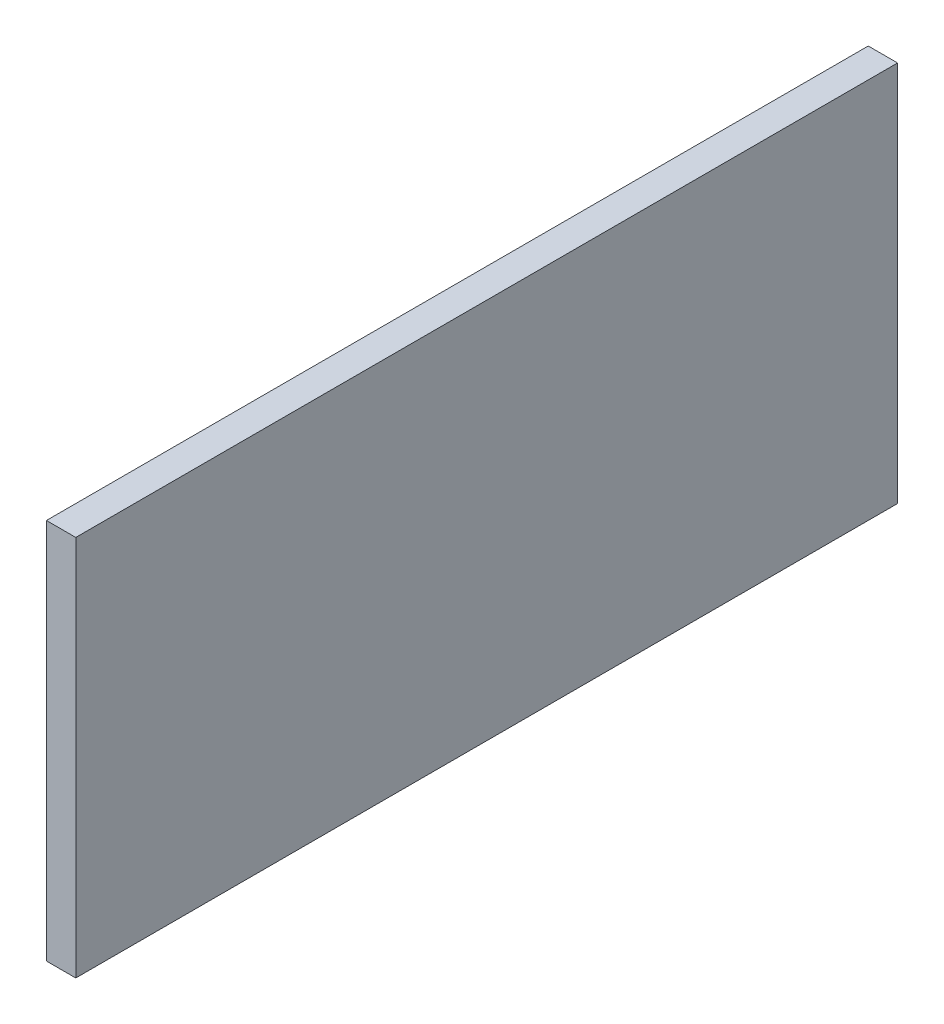
ISO-10303-21;
HEADER;
FILE_DESCRIPTION(('STEP AP214'),'2;1');
FILE_NAME('part.step','',(''),(''),'','','');
FILE_SCHEMA(('AUTOMOTIVE_DESIGN { 1 0 10303 214 1 1 1 1 }'));
ENDSEC;
DATA;
#1=APPLICATION_CONTEXT('core data for automotive mechanical design processes');
#2=APPLICATION_PROTOCOL_DEFINITION('international standard','automotive_design',2000,#1);
#3=PRODUCT_CONTEXT('',#1,'mechanical');
#4=PRODUCT('Part','Part','',(#3));
#5=PRODUCT_RELATED_PRODUCT_CATEGORY('part','',(#4));
#6=PRODUCT_DEFINITION_FORMATION('','',#4);
#7=PRODUCT_DEFINITION_CONTEXT('part definition',#1,'design');
#8=PRODUCT_DEFINITION('design','',#6,#7);
#9=PRODUCT_DEFINITION_SHAPE('','',#8);
#10=(LENGTH_UNIT() NAMED_UNIT(*) SI_UNIT(.MILLI.,.METRE.));
#11=(NAMED_UNIT(*) PLANE_ANGLE_UNIT() SI_UNIT($,.RADIAN.));
#12=(NAMED_UNIT(*) SI_UNIT($,.STERADIAN.) SOLID_ANGLE_UNIT());
#13=UNCERTAINTY_MEASURE_WITH_UNIT(LENGTH_MEASURE(1.E-05),#10,'distance_accuracy_value','');
#14=(GEOMETRIC_REPRESENTATION_CONTEXT(3) GLOBAL_UNCERTAINTY_ASSIGNED_CONTEXT((#13)) GLOBAL_UNIT_ASSIGNED_CONTEXT((#10,
#11,#12)) REPRESENTATION_CONTEXT('',''));
#15=CARTESIAN_POINT('',(0.,0.,0.));
#16=DIRECTION('',(0.,0.,1.));
#17=DIRECTION('',(1.,0.,0.));
#18=AXIS2_PLACEMENT_3D('',#15,#16,#17);
#19=CARTESIAN_POINT('',(6.,7.60305051409517,68.730415695083));
#20=DIRECTION('',(0.,0.,-1.));
#21=DIRECTION('',(0.,1.,0.));
#22=AXIS2_PLACEMENT_3D('',#19,#20,#21);
#23=PLANE('',#22);
#24=DIRECTION('',(0.,-1.,0.));
#25=VECTOR('',#24,1.);
#26=CARTESIAN_POINT('',(0.,7.60305051409517,68.730415695083));
#27=LINE('',#26,#25);
#28=CARTESIAN_POINT('',(0.,7.60305051409517,68.730415695083));
#29=VERTEX_POINT('',#28);
#30=CARTESIAN_POINT('',(0.,-70.3969494859048,68.730415695083));
#31=VERTEX_POINT('',#30);
#32=EDGE_CURVE('E96',#29,#31,#27,.T.);
#33=ORIENTED_EDGE('',*,*,#32,.T.);
#34=DIRECTION('',(-1.,0.,0.));
#35=VECTOR('',#34,1.);
#36=CARTESIAN_POINT('',(6.,-70.3969494859048,68.730415695083));
#37=LINE('',#36,#35);
#38=CARTESIAN_POINT('',(6.,-70.3969494859048,68.730415695083));
#39=VERTEX_POINT('',#38);
#40=EDGE_CURVE('E11',#39,#31,#37,.T.);
#41=ORIENTED_EDGE('',*,*,#40,.F.);
#42=DIRECTION('',(0.,-1.,0.));
#43=VECTOR('',#42,1.);
#44=CARTESIAN_POINT('',(6.,7.60305051409517,68.730415695083));
#45=LINE('',#44,#43);
#46=CARTESIAN_POINT('',(6.,7.60305051409517,68.730415695083));
#47=VERTEX_POINT('',#46);
#48=EDGE_CURVE('E84',#47,#39,#45,.T.);
#49=ORIENTED_EDGE('',*,*,#48,.F.);
#50=DIRECTION('',(-1.,0.,0.));
#51=VECTOR('',#50,1.);
#52=CARTESIAN_POINT('',(6.,7.60305051409517,68.730415695083));
#53=LINE('',#52,#51);
#54=EDGE_CURVE('E92',#47,#29,#53,.T.);
#55=ORIENTED_EDGE('',*,*,#54,.T.);
#56=EDGE_LOOP('',(#33,#41,#49,#55));
#57=FACE_BOUND('',#56,.T.);
#58=ADVANCED_FACE('F33',(#57),#23,.F.);
#59=CARTESIAN_POINT('',(6.,-70.3969494859048,68.730415695083));
#60=DIRECTION('',(0.,1.,0.));
#61=DIRECTION('',(0.,0.,1.));
#62=AXIS2_PLACEMENT_3D('',#59,#60,#61);
#63=PLANE('',#62);
#64=DIRECTION('',(0.,0.,-1.));
#65=VECTOR('',#64,1.);
#66=CARTESIAN_POINT('',(0.,-70.3969494859048,68.730415695083));
#67=LINE('',#66,#65);
#68=CARTESIAN_POINT('',(0.,-70.3969494859048,-99.2695843049171));
#69=VERTEX_POINT('',#68);
#70=EDGE_CURVE('E88',#31,#69,#67,.T.);
#71=ORIENTED_EDGE('',*,*,#70,.T.);
#72=DIRECTION('',(-1.,0.,0.));
#73=VECTOR('',#72,1.);
#74=CARTESIAN_POINT('',(6.,-70.3969494859048,-99.2695843049171));
#75=LINE('',#74,#73);
#76=CARTESIAN_POINT('',(6.,-70.3969494859048,-99.2695843049171));
#77=VERTEX_POINT('',#76);
#78=EDGE_CURVE('E41',#77,#69,#75,.T.);
#79=ORIENTED_EDGE('',*,*,#78,.F.);
#80=DIRECTION('',(0.,0.,-1.));
#81=VECTOR('',#80,1.);
#82=CARTESIAN_POINT('',(6.,-70.3969494859048,68.730415695083));
#83=LINE('',#82,#81);
#84=EDGE_CURVE('E79',#39,#77,#83,.T.);
#85=ORIENTED_EDGE('',*,*,#84,.F.);
#86=ORIENTED_EDGE('',*,*,#40,.T.);
#87=EDGE_LOOP('',(#71,#79,#85,#86));
#88=FACE_BOUND('',#87,.T.);
#89=ADVANCED_FACE('F87',(#88),#63,.F.);
#90=CARTESIAN_POINT('',(6.,7.60305051409517,-99.2695843049171));
#91=DIRECTION('',(0.,0.,1.));
#92=DIRECTION('',(1.,0.,0.));
#93=AXIS2_PLACEMENT_3D('',#90,#91,#92);
#94=PLANE('',#93);
#95=DIRECTION('',(0.,1.,0.));
#96=VECTOR('',#95,1.);
#97=CARTESIAN_POINT('',(0.,7.60305051409517,-99.2695843049171));
#98=LINE('',#97,#96);
#99=CARTESIAN_POINT('',(0.,7.60305051409517,-99.2695843049171));
#100=VERTEX_POINT('',#99);
#101=EDGE_CURVE('E66',#69,#100,#98,.T.);
#102=ORIENTED_EDGE('',*,*,#101,.T.);
#103=DIRECTION('',(-1.,0.,0.));
#104=VECTOR('',#103,1.);
#105=CARTESIAN_POINT('',(6.,7.60305051409517,-99.2695843049171));
#106=LINE('',#105,#104);
#107=CARTESIAN_POINT('',(6.,7.60305051409517,-99.2695843049171));
#108=VERTEX_POINT('',#107);
#109=EDGE_CURVE('E89',#108,#100,#106,.T.);
#110=ORIENTED_EDGE('',*,*,#109,.F.);
#111=DIRECTION('',(0.,1.,0.));
#112=VECTOR('',#111,1.);
#113=CARTESIAN_POINT('',(6.,7.60305051409517,-99.2695843049171));
#114=LINE('',#113,#112);
#115=EDGE_CURVE('E82',#77,#108,#114,.T.);
#116=ORIENTED_EDGE('',*,*,#115,.F.);
#117=ORIENTED_EDGE('',*,*,#78,.T.);
#118=EDGE_LOOP('',(#102,#110,#116,#117));
#119=FACE_BOUND('',#118,.T.);
#120=ADVANCED_FACE('F90',(#119),#94,.F.);
#121=CARTESIAN_POINT('',(6.,7.60305051409517,68.730415695083));
#122=DIRECTION('',(0.,-1.,0.));
#123=DIRECTION('',(0.,0.,-1.));
#124=AXIS2_PLACEMENT_3D('',#121,#122,#123);
#125=PLANE('',#124);
#126=DIRECTION('',(0.,0.,1.));
#127=VECTOR('',#126,1.);
#128=CARTESIAN_POINT('',(0.,7.60305051409517,68.730415695083));
#129=LINE('',#128,#127);
#130=EDGE_CURVE('E72',#100,#29,#129,.T.);
#131=ORIENTED_EDGE('',*,*,#130,.T.);
#132=ORIENTED_EDGE('',*,*,#54,.F.);
#133=DIRECTION('',(0.,0.,1.));
#134=VECTOR('',#133,1.);
#135=CARTESIAN_POINT('',(6.,7.60305051409517,68.730415695083));
#136=LINE('',#135,#134);
#137=EDGE_CURVE('E49',#108,#47,#136,.T.);
#138=ORIENTED_EDGE('',*,*,#137,.F.);
#139=ORIENTED_EDGE('',*,*,#109,.T.);
#140=EDGE_LOOP('',(#131,#132,#138,#139));
#141=FACE_BOUND('',#140,.T.);
#142=ADVANCED_FACE('F103',(#141),#125,.F.);
#143=CARTESIAN_POINT('',(6.,0.,0.));
#144=DIRECTION('',(1.,0.,0.));
#145=DIRECTION('',(0.,0.,-1.));
#146=AXIS2_PLACEMENT_3D('',#143,#144,#145);
#147=PLANE('',#146);
#148=ORIENTED_EDGE('',*,*,#48,.T.);
#149=ORIENTED_EDGE('',*,*,#84,.T.);
#150=ORIENTED_EDGE('',*,*,#115,.T.);
#151=ORIENTED_EDGE('',*,*,#137,.T.);
#152=EDGE_LOOP('',(#148,#149,#150,#151));
#153=FACE_BOUND('',#152,.T.);
#154=ADVANCED_FACE('F80',(#153),#147,.T.);
#155=CARTESIAN_POINT('',(0.,0.,0.));
#156=DIRECTION('',(1.,0.,0.));
#157=DIRECTION('',(0.,0.,-1.));
#158=AXIS2_PLACEMENT_3D('',#155,#156,#157);
#159=PLANE('',#158);
#160=ORIENTED_EDGE('',*,*,#32,.F.);
#161=ORIENTED_EDGE('',*,*,#130,.F.);
#162=ORIENTED_EDGE('',*,*,#101,.F.);
#163=ORIENTED_EDGE('',*,*,#70,.F.);
#164=EDGE_LOOP('',(#160,#161,#162,#163));
#165=FACE_BOUND('',#164,.T.);
#166=ADVANCED_FACE('F106',(#165),#159,.F.);
#167=CLOSED_SHELL('',(#58,#89,#120,#142,#154,#166));
#168=MANIFOLD_SOLID_BREP('B2',#167);
#169=ADVANCED_BREP_SHAPE_REPRESENTATION('',(#18,#168),#14);
#170=SHAPE_DEFINITION_REPRESENTATION(#9,#169);
ENDSEC;
END-ISO-10303-21;
